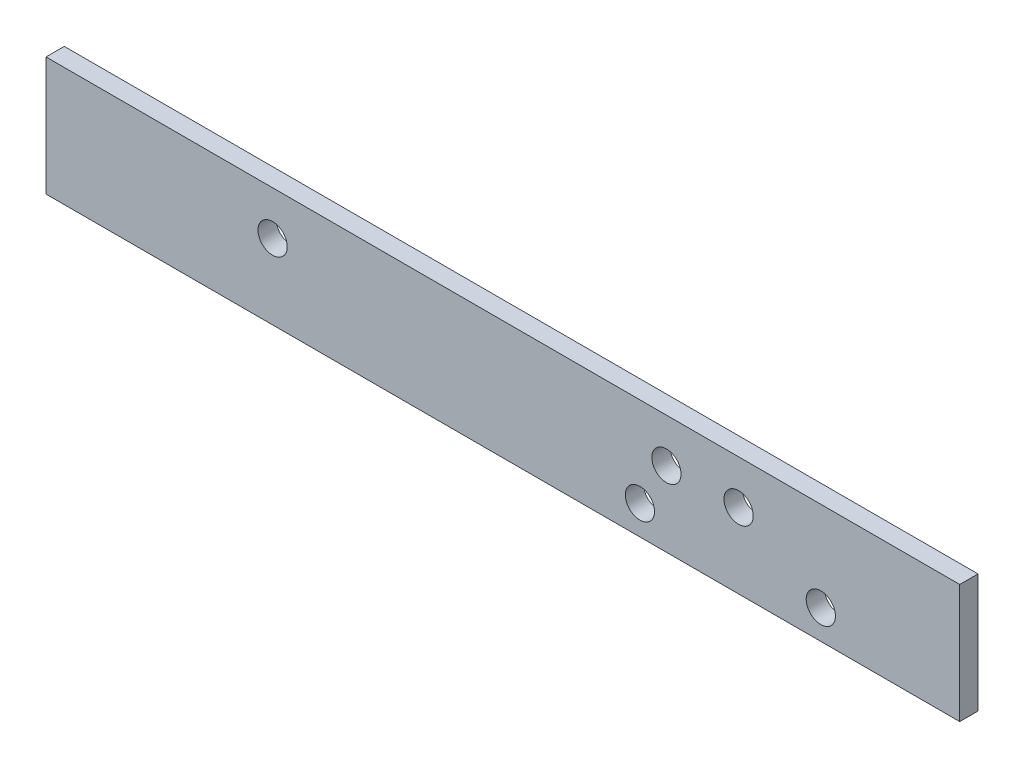
ISO-10303-21;
HEADER;
FILE_DESCRIPTION(('STEP AP214'),'2;1');
FILE_NAME('part.step','',(''),(''),'','','');
FILE_SCHEMA(('AUTOMOTIVE_DESIGN { 1 0 10303 214 1 1 1 1 }'));
ENDSEC;
DATA;
#1=APPLICATION_CONTEXT('core data for automotive mechanical design processes');
#2=APPLICATION_PROTOCOL_DEFINITION('international standard','automotive_design',2000,#1);
#3=PRODUCT_CONTEXT('',#1,'mechanical');
#4=PRODUCT('Part','Part','',(#3));
#5=PRODUCT_RELATED_PRODUCT_CATEGORY('part','',(#4));
#6=PRODUCT_DEFINITION_FORMATION('','',#4);
#7=PRODUCT_DEFINITION_CONTEXT('part definition',#1,'design');
#8=PRODUCT_DEFINITION('design','',#6,#7);
#9=PRODUCT_DEFINITION_SHAPE('','',#8);
#10=(LENGTH_UNIT() NAMED_UNIT(*) SI_UNIT(.MILLI.,.METRE.));
#11=(NAMED_UNIT(*) PLANE_ANGLE_UNIT() SI_UNIT($,.RADIAN.));
#12=(NAMED_UNIT(*) SI_UNIT($,.STERADIAN.) SOLID_ANGLE_UNIT());
#13=UNCERTAINTY_MEASURE_WITH_UNIT(LENGTH_MEASURE(1.E-05),#10,'distance_accuracy_value','');
#14=(GEOMETRIC_REPRESENTATION_CONTEXT(3) GLOBAL_UNCERTAINTY_ASSIGNED_CONTEXT((#13)) GLOBAL_UNIT_ASSIGNED_CONTEXT((#10,
#11,#12)) REPRESENTATION_CONTEXT('',''));
#15=CARTESIAN_POINT('',(0.,0.,0.));
#16=DIRECTION('',(0.,0.,1.));
#17=DIRECTION('',(1.,0.,0.));
#18=AXIS2_PLACEMENT_3D('',#15,#16,#17);
#19=CARTESIAN_POINT('',(0.,0.,2.));
#20=DIRECTION('',(0.,0.,-1.));
#21=DIRECTION('',(-1.,0.,0.));
#22=AXIS2_PLACEMENT_3D('',#19,#20,#21);
#23=PLANE('',#22);
#24=DIRECTION('',(0.,-1.,0.));
#25=VECTOR('',#24,1.);
#26=CARTESIAN_POINT('',(0.,0.,2.));
#27=LINE('',#26,#25);
#28=CARTESIAN_POINT('',(0.,13.,2.));
#29=VERTEX_POINT('',#28);
#30=CARTESIAN_POINT('',(0.,0.,2.));
#31=VERTEX_POINT('',#30);
#32=EDGE_CURVE('E97',#29,#31,#27,.T.);
#33=ORIENTED_EDGE('',*,*,#32,.T.);
#34=DIRECTION('',(1.,0.,0.));
#35=VECTOR('',#34,1.);
#36=CARTESIAN_POINT('',(0.,0.,2.));
#37=LINE('',#36,#35);
#38=CARTESIAN_POINT('',(100.,0.,2.));
#39=VERTEX_POINT('',#38);
#40=EDGE_CURVE('E92',#31,#39,#37,.T.);
#41=ORIENTED_EDGE('',*,*,#40,.T.);
#42=DIRECTION('',(0.,1.,0.));
#43=VECTOR('',#42,1.);
#44=CARTESIAN_POINT('',(100.,0.,2.));
#45=LINE('',#44,#43);
#46=CARTESIAN_POINT('',(100.,13.,2.));
#47=VERTEX_POINT('',#46);
#48=EDGE_CURVE('E95',#39,#47,#45,.T.);
#49=ORIENTED_EDGE('',*,*,#48,.T.);
#50=DIRECTION('',(-1.,0.,0.));
#51=VECTOR('',#50,1.);
#52=CARTESIAN_POINT('',(0.,13.,2.));
#53=LINE('',#52,#51);
#54=EDGE_CURVE('E62',#47,#29,#53,.T.);
#55=ORIENTED_EDGE('',*,*,#54,.T.);
#56=EDGE_LOOP('',(#33,#41,#49,#55));
#57=FACE_BOUND('',#56,.T.);
#58=CARTESIAN_POINT('',(84.8,3.2,2.));
#59=DIRECTION('',(0.,0.,1.));
#60=DIRECTION('',(1.,0.,0.));
#61=AXIS2_PLACEMENT_3D('',#58,#59,#60);
#62=CIRCLE('',#61,1.60000000000001);
#63=CARTESIAN_POINT('',(86.4,3.2,2.));
#64=VERTEX_POINT('',#63);
#65=EDGE_CURVE('E117',#64,#64,#62,.T.);
#66=ORIENTED_EDGE('',*,*,#65,.F.);
#67=EDGE_LOOP('',(#66));
#68=FACE_BOUND('',#67,.T.);
#69=CARTESIAN_POINT('',(75.8,8.2,2.));
#70=DIRECTION('',(0.,0.,1.));
#71=DIRECTION('',(1.,0.,0.));
#72=AXIS2_PLACEMENT_3D('',#69,#70,#71);
#73=CIRCLE('',#72,1.6);
#74=CARTESIAN_POINT('',(77.4,8.2,2.));
#75=VERTEX_POINT('',#74);
#76=EDGE_CURVE('E139',#75,#75,#73,.T.);
#77=ORIENTED_EDGE('',*,*,#76,.F.);
#78=EDGE_LOOP('',(#77));
#79=FACE_BOUND('',#78,.T.);
#80=CARTESIAN_POINT('',(67.9,8.20000000000001,2.));
#81=DIRECTION('',(0.,0.,1.));
#82=DIRECTION('',(1.,0.,0.));
#83=AXIS2_PLACEMENT_3D('',#80,#81,#82);
#84=CIRCLE('',#83,1.6);
#85=CARTESIAN_POINT('',(69.5,8.20000000000001,2.));
#86=VERTEX_POINT('',#85);
#87=EDGE_CURVE('E147',#86,#86,#84,.T.);
#88=ORIENTED_EDGE('',*,*,#87,.F.);
#89=EDGE_LOOP('',(#88));
#90=FACE_BOUND('',#89,.T.);
#91=CARTESIAN_POINT('',(65.,3.2,2.));
#92=DIRECTION('',(0.,0.,1.));
#93=DIRECTION('',(1.,0.,0.));
#94=AXIS2_PLACEMENT_3D('',#91,#92,#93);
#95=CIRCLE('',#94,1.60000000000001);
#96=CARTESIAN_POINT('',(66.6,3.2,2.));
#97=VERTEX_POINT('',#96);
#98=EDGE_CURVE('E155',#97,#97,#95,.T.);
#99=ORIENTED_EDGE('',*,*,#98,.F.);
#100=EDGE_LOOP('',(#99));
#101=FACE_BOUND('',#100,.T.);
#102=CARTESIAN_POINT('',(24.8,8.2,2.));
#103=DIRECTION('',(0.,0.,1.));
#104=DIRECTION('',(1.,0.,0.));
#105=AXIS2_PLACEMENT_3D('',#102,#103,#104);
#106=CIRCLE('',#105,1.6);
#107=CARTESIAN_POINT('',(26.4,8.2,2.));
#108=VERTEX_POINT('',#107);
#109=EDGE_CURVE('E163',#108,#108,#106,.T.);
#110=ORIENTED_EDGE('',*,*,#109,.F.);
#111=EDGE_LOOP('',(#110));
#112=FACE_BOUND('',#111,.T.);
#113=ADVANCED_FACE('F44',(#57,#68,#79,#90,#101,#112),#23,.F.);
#114=CARTESIAN_POINT('',(0.,0.,0.));
#115=DIRECTION('',(0.,0.,-1.));
#116=DIRECTION('',(-1.,0.,0.));
#117=AXIS2_PLACEMENT_3D('',#114,#115,#116);
#118=PLANE('',#117);
#119=CARTESIAN_POINT('',(65.,3.2,0.));
#120=DIRECTION('',(0.,0.,1.));
#121=DIRECTION('',(1.,0.,0.));
#122=AXIS2_PLACEMENT_3D('',#119,#120,#121);
#123=CIRCLE('',#122,1.60000000000001);
#124=CARTESIAN_POINT('',(66.6,3.2,0.));
#125=VERTEX_POINT('',#124);
#126=EDGE_CURVE('E159',#125,#125,#123,.T.);
#127=ORIENTED_EDGE('',*,*,#126,.T.);
#128=EDGE_LOOP('',(#127));
#129=FACE_BOUND('',#128,.T.);
#130=CARTESIAN_POINT('',(75.8,8.2,0.));
#131=DIRECTION('',(0.,0.,1.));
#132=DIRECTION('',(1.,0.,0.));
#133=AXIS2_PLACEMENT_3D('',#130,#131,#132);
#134=CIRCLE('',#133,1.6);
#135=CARTESIAN_POINT('',(77.4,8.2,0.));
#136=VERTEX_POINT('',#135);
#137=EDGE_CURVE('E143',#136,#136,#134,.T.);
#138=ORIENTED_EDGE('',*,*,#137,.T.);
#139=EDGE_LOOP('',(#138));
#140=FACE_BOUND('',#139,.T.);
#141=DIRECTION('',(0.,-1.,0.));
#142=VECTOR('',#141,1.);
#143=CARTESIAN_POINT('',(0.,0.,0.));
#144=LINE('',#143,#142);
#145=CARTESIAN_POINT('',(0.,13.,0.));
#146=VERTEX_POINT('',#145);
#147=CARTESIAN_POINT('',(0.,0.,0.));
#148=VERTEX_POINT('',#147);
#149=EDGE_CURVE('E113',#146,#148,#144,.T.);
#150=ORIENTED_EDGE('',*,*,#149,.F.);
#151=DIRECTION('',(-1.,0.,0.));
#152=VECTOR('',#151,1.);
#153=CARTESIAN_POINT('',(0.,13.,0.));
#154=LINE('',#153,#152);
#155=CARTESIAN_POINT('',(100.,13.,0.));
#156=VERTEX_POINT('',#155);
#157=EDGE_CURVE('E85',#156,#146,#154,.T.);
#158=ORIENTED_EDGE('',*,*,#157,.F.);
#159=DIRECTION('',(0.,1.,0.));
#160=VECTOR('',#159,1.);
#161=CARTESIAN_POINT('',(100.,0.,0.));
#162=LINE('',#161,#160);
#163=CARTESIAN_POINT('',(100.,0.,0.));
#164=VERTEX_POINT('',#163);
#165=EDGE_CURVE('E79',#164,#156,#162,.T.);
#166=ORIENTED_EDGE('',*,*,#165,.F.);
#167=DIRECTION('',(1.,0.,0.));
#168=VECTOR('',#167,1.);
#169=CARTESIAN_POINT('',(0.,0.,0.));
#170=LINE('',#169,#168);
#171=EDGE_CURVE('E102',#148,#164,#170,.T.);
#172=ORIENTED_EDGE('',*,*,#171,.F.);
#173=EDGE_LOOP('',(#150,#158,#166,#172));
#174=FACE_BOUND('',#173,.T.);
#175=CARTESIAN_POINT('',(84.8,3.2,0.));
#176=DIRECTION('',(0.,0.,1.));
#177=DIRECTION('',(1.,0.,0.));
#178=AXIS2_PLACEMENT_3D('',#175,#176,#177);
#179=CIRCLE('',#178,1.60000000000001);
#180=CARTESIAN_POINT('',(86.4,3.2,0.));
#181=VERTEX_POINT('',#180);
#182=EDGE_CURVE('E135',#181,#181,#179,.T.);
#183=ORIENTED_EDGE('',*,*,#182,.T.);
#184=EDGE_LOOP('',(#183));
#185=FACE_BOUND('',#184,.T.);
#186=CARTESIAN_POINT('',(67.9,8.20000000000001,0.));
#187=DIRECTION('',(0.,0.,1.));
#188=DIRECTION('',(1.,0.,0.));
#189=AXIS2_PLACEMENT_3D('',#186,#187,#188);
#190=CIRCLE('',#189,1.6);
#191=CARTESIAN_POINT('',(69.5,8.20000000000001,0.));
#192=VERTEX_POINT('',#191);
#193=EDGE_CURVE('E151',#192,#192,#190,.T.);
#194=ORIENTED_EDGE('',*,*,#193,.T.);
#195=EDGE_LOOP('',(#194));
#196=FACE_BOUND('',#195,.T.);
#197=CARTESIAN_POINT('',(24.8,8.2,0.));
#198=DIRECTION('',(0.,0.,1.));
#199=DIRECTION('',(1.,0.,0.));
#200=AXIS2_PLACEMENT_3D('',#197,#198,#199);
#201=CIRCLE('',#200,1.6);
#202=CARTESIAN_POINT('',(26.4,8.2,0.));
#203=VERTEX_POINT('',#202);
#204=EDGE_CURVE('E167',#203,#203,#201,.T.);
#205=ORIENTED_EDGE('',*,*,#204,.T.);
#206=EDGE_LOOP('',(#205));
#207=FACE_BOUND('',#206,.T.);
#208=ADVANCED_FACE('F130',(#129,#140,#174,#185,#196,#207),#118,.T.);
#209=CARTESIAN_POINT('',(0.,0.,2.));
#210=DIRECTION('',(1.,0.,0.));
#211=DIRECTION('',(0.,0.,-1.));
#212=AXIS2_PLACEMENT_3D('',#209,#210,#211);
#213=PLANE('',#212);
#214=ORIENTED_EDGE('',*,*,#149,.T.);
#215=DIRECTION('',(0.,0.,-1.));
#216=VECTOR('',#215,1.);
#217=CARTESIAN_POINT('',(0.,0.,2.));
#218=LINE('',#217,#216);
#219=EDGE_CURVE('E11',#31,#148,#218,.T.);
#220=ORIENTED_EDGE('',*,*,#219,.F.);
#221=ORIENTED_EDGE('',*,*,#32,.F.);
#222=DIRECTION('',(0.,0.,-1.));
#223=VECTOR('',#222,1.);
#224=CARTESIAN_POINT('',(0.,13.,2.));
#225=LINE('',#224,#223);
#226=EDGE_CURVE('E109',#29,#146,#225,.T.);
#227=ORIENTED_EDGE('',*,*,#226,.T.);
#228=EDGE_LOOP('',(#214,#220,#221,#227));
#229=FACE_BOUND('',#228,.T.);
#230=ADVANCED_FACE('F46',(#229),#213,.F.);
#231=CARTESIAN_POINT('',(0.,0.,2.));
#232=DIRECTION('',(0.,1.,0.));
#233=DIRECTION('',(0.,0.,1.));
#234=AXIS2_PLACEMENT_3D('',#231,#232,#233);
#235=PLANE('',#234);
#236=ORIENTED_EDGE('',*,*,#171,.T.);
#237=DIRECTION('',(0.,0.,-1.));
#238=VECTOR('',#237,1.);
#239=CARTESIAN_POINT('',(100.,0.,2.));
#240=LINE('',#239,#238);
#241=EDGE_CURVE('E54',#39,#164,#240,.T.);
#242=ORIENTED_EDGE('',*,*,#241,.F.);
#243=ORIENTED_EDGE('',*,*,#40,.F.);
#244=ORIENTED_EDGE('',*,*,#219,.T.);
#245=EDGE_LOOP('',(#236,#242,#243,#244));
#246=FACE_BOUND('',#245,.T.);
#247=ADVANCED_FACE('F101',(#246),#235,.F.);
#248=CARTESIAN_POINT('',(100.,0.,2.));
#249=DIRECTION('',(-1.,0.,0.));
#250=DIRECTION('',(0.,0.,1.));
#251=AXIS2_PLACEMENT_3D('',#248,#249,#250);
#252=PLANE('',#251);
#253=ORIENTED_EDGE('',*,*,#165,.T.);
#254=DIRECTION('',(0.,0.,-1.));
#255=VECTOR('',#254,1.);
#256=CARTESIAN_POINT('',(100.,13.,2.));
#257=LINE('',#256,#255);
#258=EDGE_CURVE('E104',#47,#156,#257,.T.);
#259=ORIENTED_EDGE('',*,*,#258,.F.);
#260=ORIENTED_EDGE('',*,*,#48,.F.);
#261=ORIENTED_EDGE('',*,*,#241,.T.);
#262=EDGE_LOOP('',(#253,#259,#260,#261));
#263=FACE_BOUND('',#262,.T.);
#264=ADVANCED_FACE('F105',(#263),#252,.F.);
#265=CARTESIAN_POINT('',(0.,13.,2.));
#266=DIRECTION('',(0.,-1.,0.));
#267=DIRECTION('',(0.,0.,-1.));
#268=AXIS2_PLACEMENT_3D('',#265,#266,#267);
#269=PLANE('',#268);
#270=ORIENTED_EDGE('',*,*,#157,.T.);
#271=ORIENTED_EDGE('',*,*,#226,.F.);
#272=ORIENTED_EDGE('',*,*,#54,.F.);
#273=ORIENTED_EDGE('',*,*,#258,.T.);
#274=EDGE_LOOP('',(#270,#271,#272,#273));
#275=FACE_BOUND('',#274,.T.);
#276=ADVANCED_FACE('F127',(#275),#269,.F.);
#277=CARTESIAN_POINT('',(84.8,3.2,2.));
#278=DIRECTION('',(0.,0.,-1.));
#279=DIRECTION('',(-1.,0.,0.));
#280=AXIS2_PLACEMENT_3D('',#277,#278,#279);
#281=CYLINDRICAL_SURFACE('',#280,1.60000000000001);
#282=ORIENTED_EDGE('',*,*,#65,.T.);
#283=EDGE_LOOP('',(#282));
#284=FACE_BOUND('',#283,.T.);
#285=ORIENTED_EDGE('',*,*,#182,.F.);
#286=EDGE_LOOP('',(#285));
#287=FACE_BOUND('',#286,.T.);
#288=ADVANCED_FACE('F186',(#284,#287),#281,.F.);
#289=CARTESIAN_POINT('',(75.8,8.2,2.));
#290=DIRECTION('',(0.,0.,-1.));
#291=DIRECTION('',(-1.,0.,0.));
#292=AXIS2_PLACEMENT_3D('',#289,#290,#291);
#293=CYLINDRICAL_SURFACE('',#292,1.6);
#294=ORIENTED_EDGE('',*,*,#76,.T.);
#295=EDGE_LOOP('',(#294));
#296=FACE_BOUND('',#295,.T.);
#297=ORIENTED_EDGE('',*,*,#137,.F.);
#298=EDGE_LOOP('',(#297));
#299=FACE_BOUND('',#298,.T.);
#300=ADVANCED_FACE('F231',(#296,#299),#293,.F.);
#301=CARTESIAN_POINT('',(67.9,8.20000000000001,2.));
#302=DIRECTION('',(0.,0.,-1.));
#303=DIRECTION('',(-1.,0.,0.));
#304=AXIS2_PLACEMENT_3D('',#301,#302,#303);
#305=CYLINDRICAL_SURFACE('',#304,1.6);
#306=ORIENTED_EDGE('',*,*,#87,.T.);
#307=EDGE_LOOP('',(#306));
#308=FACE_BOUND('',#307,.T.);
#309=ORIENTED_EDGE('',*,*,#193,.F.);
#310=EDGE_LOOP('',(#309));
#311=FACE_BOUND('',#310,.T.);
#312=ADVANCED_FACE('F239',(#308,#311),#305,.F.);
#313=CARTESIAN_POINT('',(65.,3.2,2.));
#314=DIRECTION('',(0.,0.,-1.));
#315=DIRECTION('',(-1.,0.,0.));
#316=AXIS2_PLACEMENT_3D('',#313,#314,#315);
#317=CYLINDRICAL_SURFACE('',#316,1.60000000000001);
#318=ORIENTED_EDGE('',*,*,#98,.T.);
#319=EDGE_LOOP('',(#318));
#320=FACE_BOUND('',#319,.T.);
#321=ORIENTED_EDGE('',*,*,#126,.F.);
#322=EDGE_LOOP('',(#321));
#323=FACE_BOUND('',#322,.T.);
#324=ADVANCED_FACE('F247',(#320,#323),#317,.F.);
#325=CARTESIAN_POINT('',(24.8,8.2,2.));
#326=DIRECTION('',(0.,0.,-1.));
#327=DIRECTION('',(-1.,0.,0.));
#328=AXIS2_PLACEMENT_3D('',#325,#326,#327);
#329=CYLINDRICAL_SURFACE('',#328,1.6);
#330=ORIENTED_EDGE('',*,*,#109,.T.);
#331=EDGE_LOOP('',(#330));
#332=FACE_BOUND('',#331,.T.);
#333=ORIENTED_EDGE('',*,*,#204,.F.);
#334=EDGE_LOOP('',(#333));
#335=FACE_BOUND('',#334,.T.);
#336=ADVANCED_FACE('F175',(#332,#335),#329,.F.);
#337=CLOSED_SHELL('',(#113,#208,#230,#247,#264,#276,#288,#300,#312,#324,#336));
#338=MANIFOLD_SOLID_BREP('B2',#337);
#339=ADVANCED_BREP_SHAPE_REPRESENTATION('',(#18,#338),#14);
#340=SHAPE_DEFINITION_REPRESENTATION(#9,#339);
ENDSEC;
END-ISO-10303-21;
